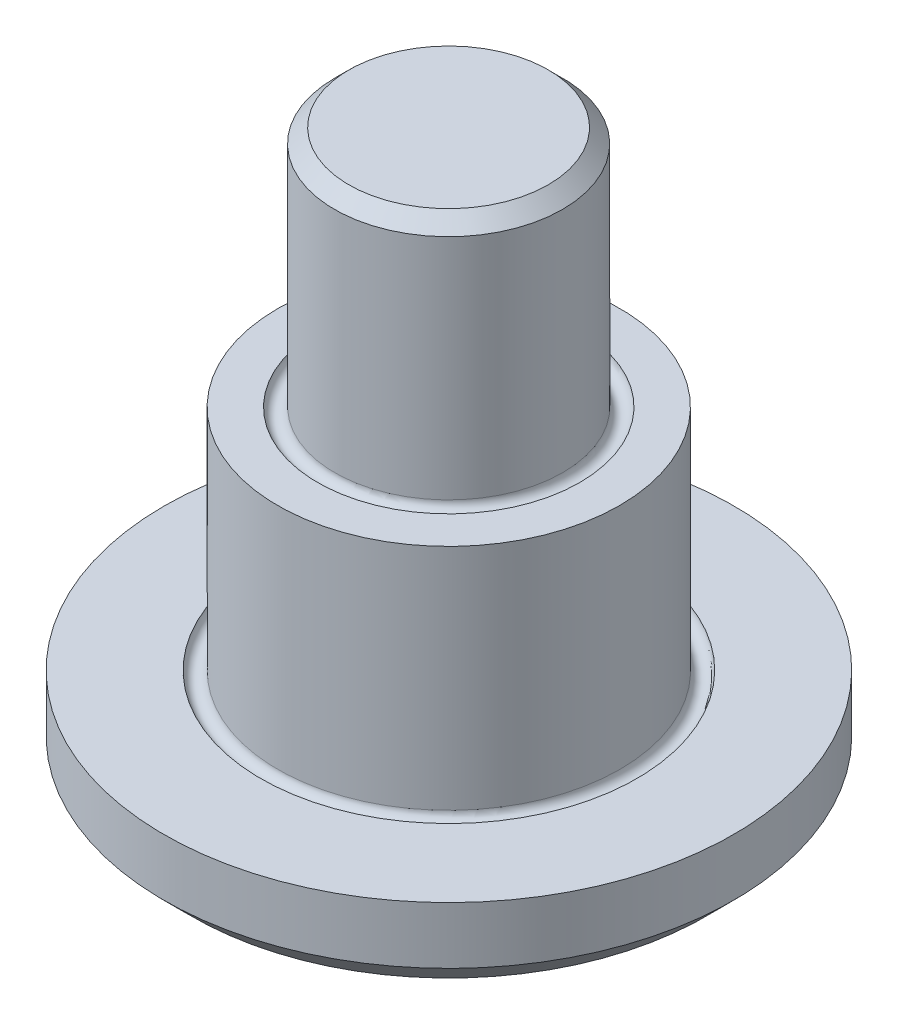
ISO-10303-21;
HEADER;
FILE_DESCRIPTION(('STEP AP214'),'2;1');
FILE_NAME('part.step','',(''),(''),'','','');
FILE_SCHEMA(('AUTOMOTIVE_DESIGN { 1 0 10303 214 1 1 1 1 }'));
ENDSEC;
DATA;
#1=APPLICATION_CONTEXT('core data for automotive mechanical design processes');
#2=APPLICATION_PROTOCOL_DEFINITION('international standard','automotive_design',2000,#1);
#3=PRODUCT_CONTEXT('',#1,'mechanical');
#4=PRODUCT('Part','Part','',(#3));
#5=PRODUCT_RELATED_PRODUCT_CATEGORY('part','',(#4));
#6=PRODUCT_DEFINITION_FORMATION('','',#4);
#7=PRODUCT_DEFINITION_CONTEXT('part definition',#1,'design');
#8=PRODUCT_DEFINITION('design','',#6,#7);
#9=PRODUCT_DEFINITION_SHAPE('','',#8);
#10=(LENGTH_UNIT() NAMED_UNIT(*) SI_UNIT(.MILLI.,.METRE.));
#11=(NAMED_UNIT(*) PLANE_ANGLE_UNIT() SI_UNIT($,.RADIAN.));
#12=(NAMED_UNIT(*) SI_UNIT($,.STERADIAN.) SOLID_ANGLE_UNIT());
#13=UNCERTAINTY_MEASURE_WITH_UNIT(LENGTH_MEASURE(1.E-05),#10,'distance_accuracy_value','');
#14=(GEOMETRIC_REPRESENTATION_CONTEXT(3) GLOBAL_UNCERTAINTY_ASSIGNED_CONTEXT((#13)) GLOBAL_UNIT_ASSIGNED_CONTEXT((#10,
#11,#12)) REPRESENTATION_CONTEXT('',''));
#15=CARTESIAN_POINT('',(0.,0.,0.));
#16=DIRECTION('',(0.,0.,1.));
#17=DIRECTION('',(1.,0.,0.));
#18=AXIS2_PLACEMENT_3D('',#15,#16,#17);
#19=CARTESIAN_POINT('',(2023.31256109605,596.995917861814,805.723430204245));
#20=DIRECTION('',(-0.000721313381192477,0.999999739073877,-3.94864932301832E-05));
#21=DIRECTION('',(-0.999999739853469,-0.000721313381754806,0.));
#22=AXIS2_PLACEMENT_3D('',#19,#20,#21);
#23=CONICAL_SURFACE('',#22,9.99999999999983,0.785398163397622);
#24=CARTESIAN_POINT('',(2023.3132818897,595.996638656243,805.723469662287));
#25=DIRECTION('',(-0.000721313381192477,0.999999739073877,-3.94864932301832E-05));
#26=DIRECTION('',(-0.999999739853469,-0.000721313381754806,0.));
#27=AXIS2_PLACEMENT_3D('',#24,#25,#26);
#28=CIRCLE('',#27,9.00072053369114);
#29=CARTESIAN_POINT('',(2014.31256369751,595.990146316077,805.723469662287));
#30=VERTEX_POINT('',#29);
#31=EDGE_CURVE('E10',#30,#30,#28,.T.);
#32=CARTESIAN_POINT('',(2023.31256109605,596.995917861814,805.723430204245));
#33=DIRECTION('',(-0.000721313381192477,0.999999739073877,-3.94864932301832E-05));
#34=DIRECTION('',(-0.999999739853469,-0.000721313381754806,0.));
#35=AXIS2_PLACEMENT_3D('',#32,#33,#34);
#36=CIRCLE('',#35,9.99999999999963);
#37=CARTESIAN_POINT('',(2013.31256369751,596.988704727996,805.723430204245));
#38=VERTEX_POINT('',#37);
#39=EDGE_CURVE('E65',#38,#38,#36,.T.);
#40=CARTESIAN_POINT('',(2014.31256369751,595.990146316077,805.723469662287));
#41=CARTESIAN_POINT('',(2014.30214703085,596.000547966201,805.723469251266));
#42=CARTESIAN_POINT('',(2014.29173036418,596.010949616325,805.723468840245));
#43=CARTESIAN_POINT('',(2014.27089703085,596.031752916574,805.723468018202));
#44=CARTESIAN_POINT('',(2014.26048036418,596.042154566698,805.723467607181));
#45=CARTESIAN_POINT('',(2014.23964703085,596.062957866946,805.723466785138));
#46=CARTESIAN_POINT('',(2014.22923036418,596.07335951707,805.723466374117));
#47=CARTESIAN_POINT('',(2014.20839703085,596.094162817318,805.723465552075));
#48=CARTESIAN_POINT('',(2014.19798036418,596.104564467443,805.723465141053));
#49=CARTESIAN_POINT('',(2014.17714703085,596.125367767691,805.723464319011));
#50=CARTESIAN_POINT('',(2014.16673036418,596.135769417815,805.72346390799));
#51=CARTESIAN_POINT('',(2014.14589703085,596.156572718064,805.723463085947));
#52=CARTESIAN_POINT('',(2014.13548036418,596.166974368188,805.723462674926));
#53=CARTESIAN_POINT('',(2014.11464703085,596.187777668436,805.723461852883));
#54=CARTESIAN_POINT('',(2014.10423036418,596.19817931856,805.723461441862));
#55=CARTESIAN_POINT('',(2014.08339703085,596.218982618808,805.723460619819));
#56=CARTESIAN_POINT('',(2014.07298036418,596.229384268933,805.723460208798));
#57=CARTESIAN_POINT('',(2014.05214703085,596.250187569181,805.723459386756));
#58=CARTESIAN_POINT('',(2014.04173036418,596.260589219305,805.723458975734));
#59=CARTESIAN_POINT('',(2014.02089703085,596.281392519553,805.723458153692));
#60=CARTESIAN_POINT('',(2014.01048036418,596.291794169677,805.72345774267));
#61=CARTESIAN_POINT('',(2013.98964703085,596.312597469926,805.723456920628));
#62=CARTESIAN_POINT('',(2013.97923036418,596.32299912005,805.723456509607));
#63=CARTESIAN_POINT('',(2013.95839703085,596.343802420298,805.723455687564));
#64=CARTESIAN_POINT('',(2013.94798036418,596.354204070422,805.723455276543));
#65=CARTESIAN_POINT('',(2013.92714703085,596.375007370671,805.7234544545));
#66=CARTESIAN_POINT('',(2013.91673036418,596.385409020795,805.723454043479));
#67=CARTESIAN_POINT('',(2013.89589703085,596.406212321043,805.723453221437));
#68=CARTESIAN_POINT('',(2013.88548036418,596.416613971167,805.723452810415));
#69=CARTESIAN_POINT('',(2013.86464703085,596.437417271416,805.723451988373));
#70=CARTESIAN_POINT('',(2013.85423036418,596.44781892154,805.723451577351));
#71=CARTESIAN_POINT('',(2013.83339703085,596.468622221788,805.723450755309));
#72=CARTESIAN_POINT('',(2013.82298036418,596.479023871912,805.723450344288));
#73=CARTESIAN_POINT('',(2013.80214703085,596.499827172161,805.723449522245));
#74=CARTESIAN_POINT('',(2013.79173036418,596.510228822285,805.723449111224));
#75=CARTESIAN_POINT('',(2013.77089703085,596.531032122533,805.723448289181));
#76=CARTESIAN_POINT('',(2013.76048036418,596.541433772657,805.72344787816));
#77=CARTESIAN_POINT('',(2013.73964703085,596.562237072906,805.723447056117));
#78=CARTESIAN_POINT('',(2013.72923036418,596.57263872303,805.723446645096));
#79=CARTESIAN_POINT('',(2013.70839703085,596.593442023278,805.723445823054));
#80=CARTESIAN_POINT('',(2013.69798036418,596.603843673402,805.723445412032));
#81=CARTESIAN_POINT('',(2013.67714703085,596.624646973651,805.72344458999));
#82=CARTESIAN_POINT('',(2013.66673036418,596.635048623775,805.723444178969));
#83=CARTESIAN_POINT('',(2013.64589703085,596.655851924023,805.723443356926));
#84=CARTESIAN_POINT('',(2013.63548036418,596.666253574147,805.723442945905));
#85=CARTESIAN_POINT('',(2013.61464703085,596.687056874396,805.723442123862));
#86=CARTESIAN_POINT('',(2013.60423036418,596.69745852452,805.723441712841));
#87=CARTESIAN_POINT('',(2013.58339703085,596.718261824768,805.723440890799));
#88=CARTESIAN_POINT('',(2013.57298036418,596.728663474892,805.723440479777));
#89=CARTESIAN_POINT('',(2013.55214703085,596.74946677514,805.723439657735));
#90=CARTESIAN_POINT('',(2013.54173036418,596.759868425265,805.723439246713));
#91=CARTESIAN_POINT('',(2013.52089703085,596.780671725513,805.723438424671));
#92=CARTESIAN_POINT('',(2013.51048036418,596.791073375637,805.72343801365));
#93=CARTESIAN_POINT('',(2013.48964703085,596.811876675885,805.723437191607));
#94=CARTESIAN_POINT('',(2013.47923036418,596.822278326009,805.723436780586));
#95=CARTESIAN_POINT('',(2013.45839703085,596.843081626258,805.723435958543));
#96=CARTESIAN_POINT('',(2013.44798036418,596.853483276382,805.723435547522));
#97=CARTESIAN_POINT('',(2013.42714703085,596.874286576631,805.723434725479));
#98=CARTESIAN_POINT('',(2013.41673036418,596.884688226755,805.723434314458));
#99=CARTESIAN_POINT('',(2013.39589703085,596.905491527003,805.723433492415));
#100=CARTESIAN_POINT('',(2013.38548036418,596.915893177127,805.723433081394));
#101=CARTESIAN_POINT('',(2013.36464703085,596.936696477375,805.723432259352));
#102=CARTESIAN_POINT('',(2013.35423036418,596.9470981275,805.723431848331));
#103=CARTESIAN_POINT('',(2013.33339703085,596.967901427748,805.723431026288));
#104=CARTESIAN_POINT('',(2013.32298036418,596.978303077872,805.723430615267));
#105=CARTESIAN_POINT('',(2013.31256369751,596.988704727996,805.723430204245));
#106=B_SPLINE_CURVE_WITH_KNOTS('',3,(#40,#41,#42,#43,#44,#45,#46,#47,#48,#49,#50,#51,#52,#53,
#54,#55,#56,#57,#58,#59,#60,#61,#62,#63,#64,#65,#66,#67,#68,#69,#70,#71,#72,#73,#74,#75,#76,#77,
#78,#79,#80,#81,#82,#83,#84,#85,#86,#87,#88,#89,#90,#91,#92,#93,#94,#95,#96,#97,#98,#99,#100,
#101,#102,#103,#104,#105),.UNSPECIFIED.,.F.,.F.,(4,2,2,2,2,2,2,2,2,2,2,2,2,2,2,2,2,2,2,2,2,2,2,
2,2,2,2,2,2,2,2,2,4),(0.,0.0441623304331195,0.0883246608657679,0.132486991298887,
0.176649321731929,0.220811652164734,0.264973982597775,0.309136313030816,0.353298643463543,
0.397460973896584,0.441623304329704,0.485785634762745,0.529947965195472,0.574110295628591,
0.618272626061554,0.662434956494359,0.7065972869274,0.750759617360441,0.794921947793247,
0.839084278226209,0.883246608659329,0.927408939092055,0.971571269525097,1.01573359995822,
1.05989593039126,1.10405826082398,1.14822059125703,1.19238292169007,1.23654525212287,
1.28070758255591,1.32486991298903,1.36903224342168,1.41319457385472),.UNSPECIFIED.);
#107=EDGE_CURVE('BSEAM31',#30,#38,#106,.T.);
#108=ORIENTED_EDGE('',*,*,#31,.T.);
#109=ORIENTED_EDGE('',*,*,#39,.F.);
#110=ORIENTED_EDGE('',*,*,#107,.T.);
#111=ORIENTED_EDGE('',*,*,#107,.F.);
#112=EDGE_LOOP('',(#108,#110,#109,#111));
#113=FACE_BOUND('',#112,.T.);
#114=ADVANCED_FACE('F31',(#113),#23,.T.);
#115=CARTESIAN_POINT('',(2032.31400008188,596.0031309964,805.723469405928));
#116=DIRECTION('',(0.000721313381192477,-0.999999739073877,3.94864932301832E-05));
#117=DIRECTION('',(0.999999739853469,0.000721313381754806,0.));
#118=AXIS2_PLACEMENT_3D('',#115,#116,#117);
#119=PLANE('',#118);
#120=ORIENTED_EDGE('',*,*,#31,.F.);
#121=EDGE_LOOP('',(#120));
#122=FACE_BOUND('',#121,.T.);
#123=ADVANCED_FACE('F73',(#122),#119,.T.);
#124=CARTESIAN_POINT('',(2023.29921627877,615.496633568184,805.722699675669));
#125=DIRECTION('',(-0.000721313381192477,0.999999739073877,-3.94864932301832E-05));
#126=DIRECTION('',(-0.999999739853469,-0.000721313381754806,0.));
#127=AXIS2_PLACEMENT_3D('',#124,#125,#126);
#128=PLANE('',#127);
#129=CARTESIAN_POINT('',(2023.29921627877,615.496633568184,805.722699675669));
#130=DIRECTION('',(-0.000721313381192477,0.999999739073877,-3.94864932301832E-05));
#131=DIRECTION('',(-0.999999739853469,-0.000721313381754806,0.));
#132=AXIS2_PLACEMENT_3D('',#129,#130,#131);
#133=CIRCLE('',#132,3.50036026684553);
#134=CARTESIAN_POINT('',(2026.799575635,615.499158424885,805.722699675669));
#135=VERTEX_POINT('',#134);
#136=EDGE_CURVE('E37',#135,#135,#133,.T.);
#137=ORIENTED_EDGE('',*,*,#136,.T.);
#138=EDGE_LOOP('',(#137));
#139=FACE_BOUND('',#138,.T.);
#140=ADVANCED_FACE('F77',(#139),#128,.T.);
#141=CARTESIAN_POINT('',(2023.29921627877,615.496633568184,805.722699675669));
#142=DIRECTION('',(0.000721313381192477,-0.999999739073877,3.94864932301832E-05));
#143=DIRECTION('',(0.999999739853469,0.000721313381754806,0.));
#144=AXIS2_PLACEMENT_3D('',#141,#142,#143);
#145=CONICAL_SURFACE('',#144,3.5003602668454,0.785398163397844);
#146=CARTESIAN_POINT('',(2023.29957667559,614.996993965399,805.72271940469));
#147=DIRECTION('',(-0.000721313381192477,0.999999739073877,-3.94864932301832E-05));
#148=DIRECTION('',(-0.999999739853469,-0.000721313381754806,0.));
#149=AXIS2_PLACEMENT_3D('',#146,#147,#148);
#150=CIRCLE('',#149,4.00000000000039);
#151=CARTESIAN_POINT('',(2027.299575635,614.999879218926,805.72271940469));
#152=VERTEX_POINT('',#151);
#153=EDGE_CURVE('E41',#152,#152,#150,.T.);
#154=CARTESIAN_POINT('',(2027.299575635,614.999879218926,805.72271940469));
#155=CARTESIAN_POINT('',(2027.29436730167,615.005080043988,805.72271919918));
#156=CARTESIAN_POINT('',(2027.28915896834,615.01028086905,805.722718993669));
#157=CARTESIAN_POINT('',(2027.27874230167,615.020682519174,805.722718582648));
#158=CARTESIAN_POINT('',(2027.27353396834,615.025883344236,805.722718377137));
#159=CARTESIAN_POINT('',(2027.26311730167,615.03628499436,805.722717966116));
#160=CARTESIAN_POINT('',(2027.25790896834,615.041485819422,805.722717760605));
#161=CARTESIAN_POINT('',(2027.24749230167,615.051887469546,805.722717349584));
#162=CARTESIAN_POINT('',(2027.24228396834,615.057088294608,805.722717144073));
#163=CARTESIAN_POINT('',(2027.23186730167,615.067489944733,805.722716733052));
#164=CARTESIAN_POINT('',(2027.22665896834,615.072690769795,805.722716527541));
#165=CARTESIAN_POINT('',(2027.21624230167,615.083092419919,805.72271611652));
#166=CARTESIAN_POINT('',(2027.21103396834,615.088293244981,805.722715911009));
#167=CARTESIAN_POINT('',(2027.20061730167,615.098694895105,805.722715499988));
#168=CARTESIAN_POINT('',(2027.19540896834,615.103895720167,805.722715294478));
#169=CARTESIAN_POINT('',(2027.18499230167,615.114297370291,805.722714883456));
#170=CARTESIAN_POINT('',(2027.17978396834,615.119498195353,805.722714677946));
#171=CARTESIAN_POINT('',(2027.16936730167,615.129899845478,805.722714266924));
#172=CARTESIAN_POINT('',(2027.16415896834,615.13510067054,805.722714061414));
#173=CARTESIAN_POINT('',(2027.15374230167,615.145502320664,805.722713650393));
#174=CARTESIAN_POINT('',(2027.14853396834,615.150703145726,805.722713444882));
#175=CARTESIAN_POINT('',(2027.13811730167,615.16110479585,805.722713033861));
#176=CARTESIAN_POINT('',(2027.13290896834,615.166305620912,805.72271282835));
#177=CARTESIAN_POINT('',(2027.12249230167,615.176707271036,805.722712417329));
#178=CARTESIAN_POINT('',(2027.11728396834,615.181908096098,805.722712211818));
#179=CARTESIAN_POINT('',(2027.10686730167,615.192309746223,805.722711800797));
#180=CARTESIAN_POINT('',(2027.10165896834,615.197510571285,805.722711595286));
#181=CARTESIAN_POINT('',(2027.09124230167,615.207912221409,805.722711184265));
#182=CARTESIAN_POINT('',(2027.08603396834,615.213113046471,805.722710978754));
#183=CARTESIAN_POINT('',(2027.07561730167,615.223514696595,805.722710567733));
#184=CARTESIAN_POINT('',(2027.07040896834,615.228715521657,805.722710362222));
#185=CARTESIAN_POINT('',(2027.05999230167,615.239117171781,805.722709951201));
#186=CARTESIAN_POINT('',(2027.05478396834,615.244317996843,805.72270974569));
#187=CARTESIAN_POINT('',(2027.04436730167,615.254719646967,805.722709334669));
#188=CARTESIAN_POINT('',(2027.03915896834,615.25992047203,805.722709129159));
#189=CARTESIAN_POINT('',(2027.02874230167,615.270322122154,805.722708718137));
#190=CARTESIAN_POINT('',(2027.02353396834,615.275522947216,805.722708512627));
#191=CARTESIAN_POINT('',(2027.01311730167,615.28592459734,805.722708101605));
#192=CARTESIAN_POINT('',(2027.00790896834,615.291125422402,805.722707896095));
#193=CARTESIAN_POINT('',(2026.99749230167,615.301527072526,805.722707485073));
#194=CARTESIAN_POINT('',(2026.99228396834,615.306727897588,805.722707279563));
#195=CARTESIAN_POINT('',(2026.98186730167,615.317129547713,805.722706868542));
#196=CARTESIAN_POINT('',(2026.97665896834,615.322330372775,805.722706663031));
#197=CARTESIAN_POINT('',(2026.96624230167,615.332732022899,805.72270625201));
#198=CARTESIAN_POINT('',(2026.96103396834,615.337932847961,805.722706046499));
#199=CARTESIAN_POINT('',(2026.95061730167,615.348334498085,805.722705635478));
#200=CARTESIAN_POINT('',(2026.94540896834,615.353535323147,805.722705429967));
#201=CARTESIAN_POINT('',(2026.93499230167,615.363936973271,805.722705018946));
#202=CARTESIAN_POINT('',(2026.92978396834,615.369137798333,805.722704813435));
#203=CARTESIAN_POINT('',(2026.91936730167,615.379539448457,805.722704402414));
#204=CARTESIAN_POINT('',(2026.91415896834,615.38474027352,805.722704196903));
#205=CARTESIAN_POINT('',(2026.90374230167,615.395141923644,805.722703785882));
#206=CARTESIAN_POINT('',(2026.89853396834,615.400342748706,805.722703580371));
#207=CARTESIAN_POINT('',(2026.88811730167,615.41074439883,805.72270316935));
#208=CARTESIAN_POINT('',(2026.88290896834,615.415945223892,805.72270296384));
#209=CARTESIAN_POINT('',(2026.87249230167,615.426346874016,805.722702552818));
#210=CARTESIAN_POINT('',(2026.86728396834,615.431547699078,805.722702347308));
#211=CARTESIAN_POINT('',(2026.85686730167,615.441949349202,805.722701936286));
#212=CARTESIAN_POINT('',(2026.85165896834,615.447150174264,805.722701730776));
#213=CARTESIAN_POINT('',(2026.84124230167,615.457551824389,805.722701319754));
#214=CARTESIAN_POINT('',(2026.83603396834,615.462752649451,805.722701114244));
#215=CARTESIAN_POINT('',(2026.82561730167,615.473154299575,805.722700703222));
#216=CARTESIAN_POINT('',(2026.82040896834,615.478355124637,805.722700497712));
#217=CARTESIAN_POINT('',(2026.80999230167,615.488756774761,805.722700086691));
#218=CARTESIAN_POINT('',(2026.80478396834,615.493957599823,805.72269988118));
#219=CARTESIAN_POINT('',(2026.799575635,615.499158424885,805.722699675669));
#220=B_SPLINE_CURVE_WITH_KNOTS('',3,(#154,#155,#156,#157,#158,#159,#160,#161,#162,#163,#164,
#165,#166,#167,#168,#169,#170,#171,#172,#173,#174,#175,#176,#177,#178,#179,#180,#181,#182,#183,
#184,#185,#186,#187,#188,#189,#190,#191,#192,#193,#194,#195,#196,#197,#198,#199,#200,#201,#202,
#203,#204,#205,#206,#207,#208,#209,#210,#211,#212,#213,#214,#215,#216,#217,#218,#219),
.UNSPECIFIED.,.F.,.F.,(4,2,2,2,2,2,2,2,2,2,2,2,2,2,2,2,2,2,2,2,2,2,2,2,2,2,2,2,2,2,2,2,4),(0.,
0.0220811652165598,0.0441623304331195,0.0662434956496793,0.0883246608661607,0.110405826082406,
0.132486991298966,0.154568156515526,0.176649321732007,0.198730486948567,0.220811652165048,
0.242892817381529,0.264973982598089,0.287055147814335,0.309136313030895,0.331217478247376,
0.353298643463936,0.375379808680495,0.397460973896977,0.419542139113536,0.441623304329782,
0.463704469546263,0.485785634762745,0.507866799979304,0.529947965195864,0.552029130412345,
0.574110295628905,0.596191460845465,0.618272626061711,0.640353791278192,0.662434956494752,
0.684516121711311,0.706597286927871),.UNSPECIFIED.);
#221=EDGE_CURVE('BSEAM82',#152,#135,#220,.T.);
#222=ORIENTED_EDGE('',*,*,#153,.T.);
#223=ORIENTED_EDGE('',*,*,#136,.F.);
#224=ORIENTED_EDGE('',*,*,#221,.T.);
#225=ORIENTED_EDGE('',*,*,#221,.F.);
#226=EDGE_LOOP('',(#222,#224,#223,#225));
#227=FACE_BOUND('',#226,.T.);
#228=ADVANCED_FACE('F82',(#227),#145,.T.);
#229=CARTESIAN_POINT('',(2023.31328232264,595.996038448663,805.723469685987));
#230=DIRECTION('',(-0.000721313381192477,0.999999739073877,-3.94864932301832E-05));
#231=DIRECTION('',(-0.999999739853469,-0.000721313381754806,0.));
#232=AXIS2_PLACEMENT_3D('',#229,#230,#231);
#233=CYLINDRICAL_SURFACE('',#232,4.00000000000051);
#234=CARTESIAN_POINT('',(2023.30534716332,606.99702283393,805.723035295579));
#235=DIRECTION('',(-0.000721313381192477,0.999999739073877,-3.94864932301832E-05));
#236=DIRECTION('',(-0.999999739853469,-0.000721313381754806,0.));
#237=AXIS2_PLACEMENT_3D('',#234,#235,#236);
#238=CIRCLE('',#237,4.00000000000053);
#239=CARTESIAN_POINT('',(2019.30534820391,606.994137580404,805.723035295579));
#240=VERTEX_POINT('',#239);
#241=EDGE_CURVE('E45',#240,#240,#238,.T.);
#242=ORIENTED_EDGE('',*,*,#241,.T.);
#243=EDGE_LOOP('',(#242));
#244=FACE_BOUND('',#243,.T.);
#245=ORIENTED_EDGE('',*,*,#153,.F.);
#246=EDGE_LOOP('',(#245));
#247=FACE_BOUND('',#246,.T.);
#248=ADVANCED_FACE('F87',(#244,#247),#233,.T.);
#249=CARTESIAN_POINT('',(2023.30534716332,606.997022833931,805.723035295579));
#250=DIRECTION('',(-0.000721313381192477,0.999999739073877,-3.94864932301832E-05));
#251=DIRECTION('',(-0.999999739853469,-0.000721313381754806,0.));
#252=AXIS2_PLACEMENT_3D('',#249,#250,#251);
#253=TOROIDAL_SURFACE('',#252,4.3000000000002,0.300000000000022);
#254=CARTESIAN_POINT('',(2023.30534744251,606.996635786056,805.723035310862));
#255=DIRECTION('',(-0.000721313381192477,0.999999739073877,-3.94864932301832E-05));
#256=DIRECTION('',(-0.999999739853469,-0.000721313381754806,0.));
#257=AXIS2_PLACEMENT_3D('',#254,#255,#256);
#258=CIRCLE('',#257,4.59999975032313);
#259=CARTESIAN_POINT('',(2018.70534888886,606.99331774468,805.723035310862));
#260=VERTEX_POINT('',#259);
#261=EDGE_CURVE('E50',#260,#260,#258,.T.);
#262=ORIENTED_EDGE('',*,*,#261,.T.);
#263=EDGE_LOOP('',(#262));
#264=FACE_BOUND('',#263,.T.);
#265=ORIENTED_EDGE('',*,*,#241,.F.);
#266=EDGE_LOOP('',(#265));
#267=FACE_BOUND('',#266,.T.);
#268=ADVANCED_FACE('F91',(#264,#267),#253,.F.);
#269=CARTESIAN_POINT('',(2027.90534599615,606.999953827427,805.723035179844));
#270=DIRECTION('',(-0.000721313381192477,0.999999739073877,-3.94864932301832E-05));
#271=DIRECTION('',(-0.999999739853469,-0.000721313381754806,0.));
#272=AXIS2_PLACEMENT_3D('',#269,#270,#271);
#273=PLANE('',#272);
#274=CARTESIAN_POINT('',(2023.30534744251,606.996635786056,805.723035310862));
#275=DIRECTION('',(-0.000721313381192477,0.999999739073877,-3.94864932301832E-05));
#276=DIRECTION('',(-0.999999739853469,-0.000721313381754806,0.));
#277=AXIS2_PLACEMENT_3D('',#274,#275,#276);
#278=CIRCLE('',#277,6.00000000000024);
#279=CARTESIAN_POINT('',(2017.30534900338,606.992307905766,805.723035310862));
#280=VERTEX_POINT('',#279);
#281=EDGE_CURVE('E53',#280,#280,#278,.T.);
#282=ORIENTED_EDGE('',*,*,#281,.T.);
#283=EDGE_LOOP('',(#282));
#284=FACE_BOUND('',#283,.T.);
#285=ORIENTED_EDGE('',*,*,#261,.F.);
#286=EDGE_LOOP('',(#285));
#287=FACE_BOUND('',#286,.T.);
#288=ADVANCED_FACE('F95',(#284,#287),#273,.T.);
#289=CARTESIAN_POINT('',(2023.31328232264,595.996038448663,805.723469685987));
#290=DIRECTION('',(-0.000721313381192477,0.999999739073877,-3.94864932301832E-05));
#291=DIRECTION('',(-0.999999739853469,-0.000721313381754806,0.));
#292=AXIS2_PLACEMENT_3D('',#289,#290,#291);
#293=CYLINDRICAL_SURFACE('',#292,6.00000000000021);
#294=CARTESIAN_POINT('',(2023.31113320315,598.975490904593,805.723352037828));
#295=DIRECTION('',(-0.000721313381192477,0.999999739073877,-3.94864932301832E-05));
#296=DIRECTION('',(-0.999999739853469,-0.000721313381754806,0.));
#297=AXIS2_PLACEMENT_3D('',#294,#295,#296);
#298=CIRCLE('',#297,5.99999999999991);
#299=CARTESIAN_POINT('',(2017.31113476403,598.971163024302,805.723352037828));
#300=VERTEX_POINT('',#299);
#301=EDGE_CURVE('E56',#300,#300,#298,.T.);
#302=CARTESIAN_POINT('',(2017.31113476403,598.971163024302,805.723352037828));
#303=CARTESIAN_POINT('',(2017.31107449569,599.054716616817,805.723348738588));
#304=CARTESIAN_POINT('',(2017.31101422735,599.138270209333,805.723345439349));
#305=CARTESIAN_POINT('',(2017.31089369067,599.305377394363,805.72333884087));
#306=CARTESIAN_POINT('',(2017.31083342233,599.388930986878,805.723335541631));
#307=CARTESIAN_POINT('',(2017.31071288565,599.556038171909,805.723328943153));
#308=CARTESIAN_POINT('',(2017.31065261731,599.639591764424,805.723325643914));
#309=CARTESIAN_POINT('',(2017.31053208063,599.806698949454,805.723319045435));
#310=CARTESIAN_POINT('',(2017.31047181229,599.89025254197,805.723315746196));
#311=CARTESIAN_POINT('',(2017.31035127561,600.057359727,805.723309147717));
#312=CARTESIAN_POINT('',(2017.31029100727,600.140913319515,805.723305848478));
#313=CARTESIAN_POINT('',(2017.31017047059,600.308020504546,805.72329925));
#314=CARTESIAN_POINT('',(2017.31011020225,600.391574097061,805.723295950761));
#315=CARTESIAN_POINT('',(2017.30998966557,600.558681282092,805.723289352282));
#316=CARTESIAN_POINT('',(2017.30992939723,600.642234874607,805.723286053043));
#317=CARTESIAN_POINT('',(2017.30980886055,600.809342059637,805.723279454565));
#318=CARTESIAN_POINT('',(2017.30974859221,600.892895652153,805.723276155325));
#319=CARTESIAN_POINT('',(2017.30962805553,601.060002837183,805.723269556847));
#320=CARTESIAN_POINT('',(2017.30956778719,601.143556429698,805.723266257608));
#321=CARTESIAN_POINT('',(2017.30944725051,601.310663614729,805.723259659129));
#322=CARTESIAN_POINT('',(2017.30938698217,601.394217207244,805.72325635989));
#323=CARTESIAN_POINT('',(2017.30926644549,601.561324392275,805.723249761411));
#324=CARTESIAN_POINT('',(2017.30920617715,601.64487798479,805.723246462172));
#325=CARTESIAN_POINT('',(2017.30908564047,601.81198516982,805.723239863694));
#326=CARTESIAN_POINT('',(2017.30902537213,601.895538762336,805.723236564455));
#327=CARTESIAN_POINT('',(2017.30890483545,602.062645947366,805.723229965976));
#328=CARTESIAN_POINT('',(2017.30884456711,602.146199539881,805.723226666737));
#329=CARTESIAN_POINT('',(2017.30872403043,602.313306724912,805.723220068258));
#330=CARTESIAN_POINT('',(2017.30866376209,602.396860317427,805.723216769019));
#331=CARTESIAN_POINT('',(2017.30854322541,602.563967502458,805.723210170541));
#332=CARTESIAN_POINT('',(2017.30848295707,602.647521094973,805.723206871301));
#333=CARTESIAN_POINT('',(2017.30836242039,602.814628280003,805.723200272823));
#334=CARTESIAN_POINT('',(2017.30830215205,602.898181872519,805.723196973584));
#335=CARTESIAN_POINT('',(2017.30818161537,603.065289057549,805.723190375105));
#336=CARTESIAN_POINT('',(2017.30812134703,603.148842650064,805.723187075866));
#337=CARTESIAN_POINT('',(2017.30800081035,603.315949835095,805.723180477388));
#338=CARTESIAN_POINT('',(2017.30794054201,603.39950342761,805.723177178148));
#339=CARTESIAN_POINT('',(2017.30782000533,603.56661061264,805.72317057967));
#340=CARTESIAN_POINT('',(2017.30775973699,603.650164205156,805.723167280431));
#341=CARTESIAN_POINT('',(2017.30763920031,603.817271390186,805.723160681952));
#342=CARTESIAN_POINT('',(2017.30757893197,603.900824982702,805.723157382713));
#343=CARTESIAN_POINT('',(2017.30745839529,604.067932167732,805.723150784235));
#344=CARTESIAN_POINT('',(2017.30739812695,604.151485760247,805.723147484995));
#345=CARTESIAN_POINT('',(2017.30727759027,604.318592945278,805.723140886517));
#346=CARTESIAN_POINT('',(2017.30721732193,604.402146537793,805.723137587278));
#347=CARTESIAN_POINT('',(2017.30709678525,604.569253722823,805.723130988799));
#348=CARTESIAN_POINT('',(2017.30703651691,604.652807315339,805.72312768956));
#349=CARTESIAN_POINT('',(2017.30691598023,604.819914500369,805.723121091082));
#350=CARTESIAN_POINT('',(2017.30685571189,604.903468092885,805.723117791842));
#351=CARTESIAN_POINT('',(2017.30673517521,605.070575277915,805.723111193364));
#352=CARTESIAN_POINT('',(2017.30667490687,605.15412887043,805.723107894125));
#353=CARTESIAN_POINT('',(2017.30655437019,605.321236055461,805.723101295646));
#354=CARTESIAN_POINT('',(2017.30649410185,605.404789647976,805.723097996407));
#355=CARTESIAN_POINT('',(2017.30637356517,605.571896833006,805.723091397929));
#356=CARTESIAN_POINT('',(2017.30631329683,605.655450425522,805.723088098689));
#357=CARTESIAN_POINT('',(2017.30619276015,605.822557610552,805.723081500211));
#358=CARTESIAN_POINT('',(2017.30613249181,605.906111203067,805.723078200972));
#359=CARTESIAN_POINT('',(2017.30601195512,606.073218388098,805.723071602493));
#360=CARTESIAN_POINT('',(2017.30595168679,606.156771980613,805.723068303254));
#361=CARTESIAN_POINT('',(2017.30583115011,606.323879165644,805.723061704776));
#362=CARTESIAN_POINT('',(2017.30577088177,606.407432758159,805.723058405536));
#363=CARTESIAN_POINT('',(2017.30565034508,606.574539943189,805.723051807058));
#364=CARTESIAN_POINT('',(2017.30559007674,606.658093535705,805.723048507819));
#365=CARTESIAN_POINT('',(2017.30546954006,606.825200720735,805.72304190934));
#366=CARTESIAN_POINT('',(2017.30540927172,606.90875431325,805.723038610101));
#367=CARTESIAN_POINT('',(2017.30534900338,606.992307905766,805.723035310862));
#368=B_SPLINE_CURVE_WITH_KNOTS('',3,(#302,#303,#304,#305,#306,#307,#308,#309,#310,#311,#312,
#313,#314,#315,#316,#317,#318,#319,#320,#321,#322,#323,#324,#325,#326,#327,#328,#329,#330,#331,
#332,#333,#334,#335,#336,#337,#338,#339,#340,#341,#342,#343,#344,#345,#346,#347,#348,#349,#350,
#351,#352,#353,#354,#355,#356,#357,#358,#359,#360,#361,#362,#363,#364,#365,#366,#367),
.UNSPECIFIED.,.F.,.F.,(4,2,2,2,2,2,2,2,2,2,2,2,2,2,2,2,2,2,2,2,2,2,2,2,2,2,2,2,2,2,2,2,4),(0.,
0.250660842949615,0.50132168589934,0.751982528849065,1.00264337179879,1.25330421474841,
1.50396505769813,1.75462590064786,2.00528674359758,2.2559475865472,2.50660842949692,
2.75726927244665,3.00793011539637,3.25859095834599,3.50925180129571,3.75991264424544,
4.01057348719516,4.26123433014478,4.5118951730945,4.76255601604423,5.01321685899395,
5.26387770194357,5.51453854489329,5.76519938784302,6.01586023079274,6.26652107374236,
6.51718191669208,6.76784275964181,7.01850360259154,7.26916444554115,7.51982528849088,
7.7704861314406,8.02114697439022),.UNSPECIFIED.);
#369=EDGE_CURVE('BSEAM99',#300,#280,#368,.T.);
#370=ORIENTED_EDGE('',*,*,#301,.T.);
#371=ORIENTED_EDGE('',*,*,#281,.F.);
#372=ORIENTED_EDGE('',*,*,#369,.T.);
#373=ORIENTED_EDGE('',*,*,#369,.F.);
#374=EDGE_LOOP('',(#370,#372,#371,#373));
#375=FACE_BOUND('',#374,.T.);
#376=ADVANCED_FACE('F99',(#375),#293,.T.);
#377=CARTESIAN_POINT('',(2023.31111807486,598.996464153859,805.723351209667));
#378=DIRECTION('',(-0.000721313381192477,0.999999739073877,-3.94864932301832E-05));
#379=DIRECTION('',(-0.999999739853469,-0.000721313381754806,0.));
#380=AXIS2_PLACEMENT_3D('',#377,#378,#379);
#381=TOROIDAL_SURFACE('',#380,6.29926597298295,0.299999999999926);
#382=CARTESIAN_POINT('',(2023.31111794955,598.996637873465,805.723351202808));
#383=DIRECTION('',(-0.000721313381192477,0.999999739073877,-3.94864932301832E-05));
#384=DIRECTION('',(-0.999999739853469,-0.000721313381754806,0.));
#385=AXIS2_PLACEMENT_3D('',#382,#383,#384);
#386=CIRCLE('',#385,6.59926592268511);
#387=CARTESIAN_POINT('',(2016.71185374365,598.991877734645,805.723351202808));
#388=VERTEX_POINT('',#387);
#389=EDGE_CURVE('E59',#388,#388,#386,.T.);
#390=ORIENTED_EDGE('',*,*,#389,.T.);
#391=EDGE_LOOP('',(#390));
#392=FACE_BOUND('',#391,.T.);
#393=ORIENTED_EDGE('',*,*,#301,.F.);
#394=EDGE_LOOP('',(#393));
#395=FACE_BOUND('',#394,.T.);
#396=ADVANCED_FACE('F103',(#392,#395),#381,.F.);
#397=CARTESIAN_POINT('',(2029.91038215546,599.001398012277,805.723351014846));
#398=DIRECTION('',(-0.000721313381192477,0.999999739073877,-3.94864932301832E-05));
#399=DIRECTION('',(-0.999999739853469,-0.000721313381754806,0.));
#400=AXIS2_PLACEMENT_3D('',#397,#398,#399);
#401=PLANE('',#400);
#402=CARTESIAN_POINT('',(2023.31111794955,598.996637873465,805.723351202808));
#403=DIRECTION('',(-0.000721313381192477,0.999999739073877,-3.94864932301832E-05));
#404=DIRECTION('',(-0.999999739853469,-0.000721313381754806,0.));
#405=AXIS2_PLACEMENT_3D('',#402,#403,#404);
#406=CIRCLE('',#405,9.99999999999963);
#407=CARTESIAN_POINT('',(2013.31112055102,598.989424739648,805.723351202808));
#408=VERTEX_POINT('',#407);
#409=EDGE_CURVE('E62',#408,#408,#406,.T.);
#410=ORIENTED_EDGE('',*,*,#409,.T.);
#411=EDGE_LOOP('',(#410));
#412=FACE_BOUND('',#411,.T.);
#413=ORIENTED_EDGE('',*,*,#389,.F.);
#414=EDGE_LOOP('',(#413));
#415=FACE_BOUND('',#414,.T.);
#416=ADVANCED_FACE('F107',(#412,#415),#401,.T.);
#417=CARTESIAN_POINT('',(2023.31328232264,595.996038448663,805.723469685987));
#418=DIRECTION('',(-0.000721313381192477,0.999999739073877,-3.94864932301832E-05));
#419=DIRECTION('',(-0.999999739853469,-0.000721313381754806,0.));
#420=AXIS2_PLACEMENT_3D('',#417,#418,#419);
#421=CYLINDRICAL_SURFACE('',#420,9.99999999999983);
#422=CARTESIAN_POINT('',(2013.31256369751,596.988704727996,805.723430204245));
#423=CARTESIAN_POINT('',(2013.31254866474,597.009545561451,805.723429381314));
#424=CARTESIAN_POINT('',(2013.31253363196,597.030386394906,805.723428558382));
#425=CARTESIAN_POINT('',(2013.31250356641,597.072068061815,805.723426912519));
#426=CARTESIAN_POINT('',(2013.31248853363,597.09290889527,805.723426089587));
#427=CARTESIAN_POINT('',(2013.31245846808,597.134590562179,805.723424443724));
#428=CARTESIAN_POINT('',(2013.31244343531,597.155431395634,805.723423620792));
#429=CARTESIAN_POINT('',(2013.31241336975,597.197113062543,805.723421974929));
#430=CARTESIAN_POINT('',(2013.31239833698,597.217953895998,805.723421151997));
#431=CARTESIAN_POINT('',(2013.31236827143,597.259635562907,805.723419506134));
#432=CARTESIAN_POINT('',(2013.31235323865,597.280476396362,805.723418683202));
#433=CARTESIAN_POINT('',(2013.3123231731,597.322158063271,805.723417037339));
#434=CARTESIAN_POINT('',(2013.31230814032,597.342998896726,805.723416214408));
#435=CARTESIAN_POINT('',(2013.31227807477,597.384680563635,805.723414568544));
#436=CARTESIAN_POINT('',(2013.31226304199,597.40552139709,805.723413745613));
#437=CARTESIAN_POINT('',(2013.31223297644,597.447203064,805.723412099749));
#438=CARTESIAN_POINT('',(2013.31221794367,597.468043897454,805.723411276818));
#439=CARTESIAN_POINT('',(2013.31218787811,597.509725564364,805.723409630954));
#440=CARTESIAN_POINT('',(2013.31217284534,597.530566397818,805.723408808023));
#441=CARTESIAN_POINT('',(2013.31214277979,597.572248064728,805.723407162159));
#442=CARTESIAN_POINT('',(2013.31212774701,597.593088898182,805.723406339228));
#443=CARTESIAN_POINT('',(2013.31209768146,597.634770565092,805.723404693365));
#444=CARTESIAN_POINT('',(2013.31208264868,597.655611398547,805.723403870433));
#445=CARTESIAN_POINT('',(2013.31205258313,597.697293065456,805.72340222457));
#446=CARTESIAN_POINT('',(2013.31203755035,597.718133898911,805.723401401638));
#447=CARTESIAN_POINT('',(2013.3120074848,597.75981556582,805.723399755775));
#448=CARTESIAN_POINT('',(2013.31199245203,597.780656399275,805.723398932843));
#449=CARTESIAN_POINT('',(2013.31196238647,597.822338066184,805.72339728698));
#450=CARTESIAN_POINT('',(2013.3119473537,597.843178899639,805.723396464048));
#451=CARTESIAN_POINT('',(2013.31191728815,597.884860566548,805.723394818185));
#452=CARTESIAN_POINT('',(2013.31190225537,597.905701400003,805.723393995253));
#453=CARTESIAN_POINT('',(2013.31187218982,597.947383066912,805.72339234939));
#454=CARTESIAN_POINT('',(2013.31185715704,597.968223900367,805.723391526458));
#455=CARTESIAN_POINT('',(2013.31182709149,598.009905567277,805.723389880595));
#456=CARTESIAN_POINT('',(2013.31181205871,598.030746400731,805.723389057663));
#457=CARTESIAN_POINT('',(2013.31178199316,598.072428067641,805.7233874118));
#458=CARTESIAN_POINT('',(2013.31176696039,598.093268901095,805.723386588868));
#459=CARTESIAN_POINT('',(2013.31173689484,598.134950568005,805.723384943005));
#460=CARTESIAN_POINT('',(2013.31172186206,598.15579140146,805.723384120073));
#461=CARTESIAN_POINT('',(2013.31169179651,598.197473068369,805.72338247421));
#462=CARTESIAN_POINT('',(2013.31167676373,598.218313901824,805.723381651278));
#463=CARTESIAN_POINT('',(2013.31164669818,598.259995568733,805.723380005415));
#464=CARTESIAN_POINT('',(2013.3116316654,598.280836402188,805.723379182484));
#465=CARTESIAN_POINT('',(2013.31160159985,598.322518069097,805.72337753662));
#466=CARTESIAN_POINT('',(2013.31158656708,598.343358902552,805.723376713689));
#467=CARTESIAN_POINT('',(2013.31155650152,598.385040569461,805.723375067825));
#468=CARTESIAN_POINT('',(2013.31154146875,598.405881402916,805.723374244894));
#469=CARTESIAN_POINT('',(2013.3115114032,598.447563069825,805.72337259903));
#470=CARTESIAN_POINT('',(2013.31149637042,598.46840390328,805.723371776099));
#471=CARTESIAN_POINT('',(2013.31146630487,598.510085570189,805.723370130235));
#472=CARTESIAN_POINT('',(2013.31145127209,598.530926403644,805.723369307304));
#473=CARTESIAN_POINT('',(2013.31142120654,598.572608070553,805.723367661441));
#474=CARTESIAN_POINT('',(2013.31140617376,598.593448904008,805.723366838509));
#475=CARTESIAN_POINT('',(2013.31137610821,598.635130570918,805.723365192646));
#476=CARTESIAN_POINT('',(2013.31136107544,598.655971404372,805.723364369714));
#477=CARTESIAN_POINT('',(2013.31133100988,598.697653071282,805.723362723851));
#478=CARTESIAN_POINT('',(2013.31131597711,598.718493904736,805.723361900919));
#479=CARTESIAN_POINT('',(2013.31128591156,598.760175571646,805.723360255056));
#480=CARTESIAN_POINT('',(2013.31127087878,598.781016405101,805.723359432124));
#481=CARTESIAN_POINT('',(2013.31124081323,598.82269807201,805.723357786261));
#482=CARTESIAN_POINT('',(2013.31122578045,598.843538905465,805.723356963329));
#483=CARTESIAN_POINT('',(2013.3111957149,598.885220572374,805.723355317466));
#484=CARTESIAN_POINT('',(2013.31118068212,598.906061405829,805.723354494534));
#485=CARTESIAN_POINT('',(2013.31115061657,598.947743072738,805.723352848671));
#486=CARTESIAN_POINT('',(2013.3111355838,598.968583906193,805.723352025739));
#487=CARTESIAN_POINT('',(2013.31112055102,598.989424739648,805.723351202808));
#488=B_SPLINE_CURVE_WITH_KNOTS('',3,(#422,#423,#424,#425,#426,#427,#428,#429,#430,#431,#432,
#433,#434,#435,#436,#437,#438,#439,#440,#441,#442,#443,#444,#445,#446,#447,#448,#449,#450,#451,
#452,#453,#454,#455,#456,#457,#458,#459,#460,#461,#462,#463,#464,#465,#466,#467,#468,#469,#470,
#471,#472,#473,#474,#475,#476,#477,#478,#479,#480,#481,#482,#483,#484,#485,#486,#487),
.UNSPECIFIED.,.F.,.F.,(4,2,2,2,2,2,2,2,2,2,2,2,2,2,2,2,2,2,2,2,2,2,2,2,2,2,2,2,2,2,2,2,4),(0.,
0.0625225166778505,0.125045033355701,0.187567550033552,0.250090066711402,0.312612583389253,
0.375135100067104,0.437657616744954,0.500180133422805,0.562702650100656,0.625225166778506,
0.687747683456468,0.750270200134319,0.812792716812169,0.87531523349002,0.937837750167871,
1.00036026684572,1.06288278352357,1.12540530020142,1.18792781687927,1.25045033355712,
1.31297285023497,1.37549536691294,1.43801788359079,1.50054040026864,1.56306291694649,
1.62558543362434,1.68810795030219,1.75063046698004,1.81315298365789,1.87567550033574,
1.93819801701359,2.00072053369155),.UNSPECIFIED.);
#489=EDGE_CURVE('BSEAM69',#38,#408,#488,.T.);
#490=ORIENTED_EDGE('',*,*,#39,.T.);
#491=ORIENTED_EDGE('',*,*,#409,.F.);
#492=ORIENTED_EDGE('',*,*,#489,.T.);
#493=ORIENTED_EDGE('',*,*,#489,.F.);
#494=EDGE_LOOP('',(#490,#492,#491,#493));
#495=FACE_BOUND('',#494,.T.);
#496=ADVANCED_FACE('F69',(#495),#421,.T.);
#497=CLOSED_SHELL('',(#114,#123,#140,#228,#248,#268,#288,#376,#396,#416,#496));
#498=MANIFOLD_SOLID_BREP('B2',#497);
#499=ADVANCED_BREP_SHAPE_REPRESENTATION('',(#18,#498),#14);
#500=SHAPE_DEFINITION_REPRESENTATION(#9,#499);
ENDSEC;
END-ISO-10303-21;
